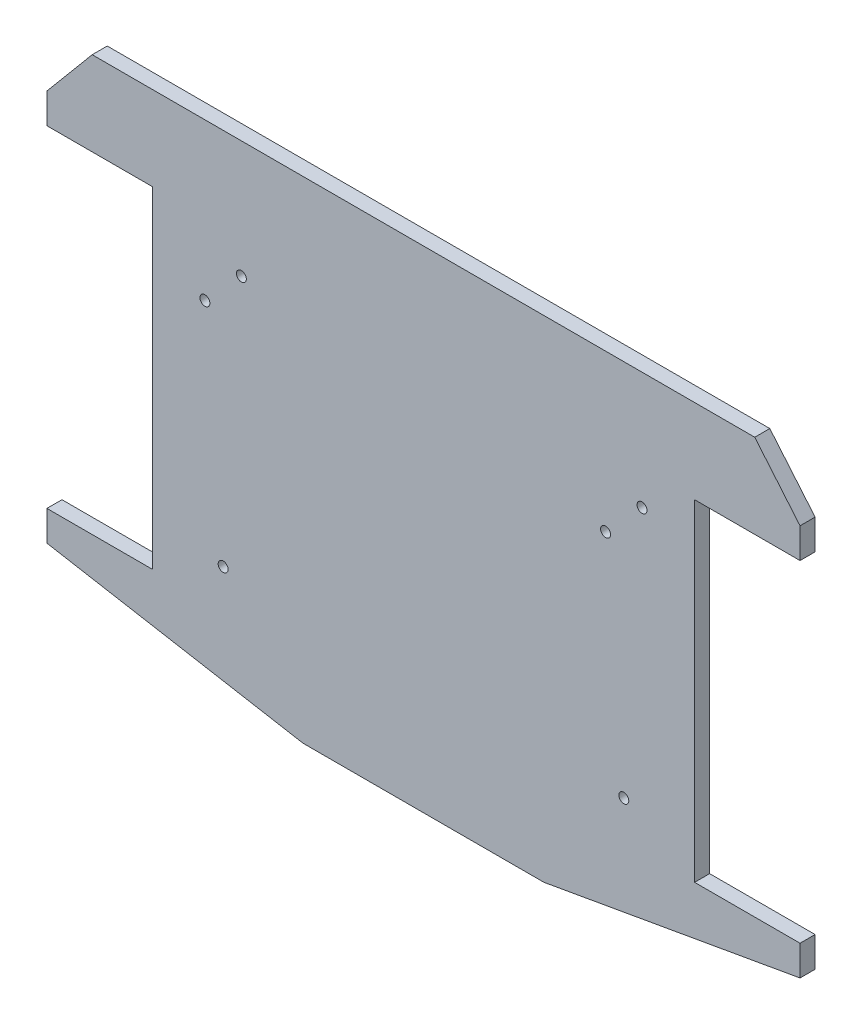
ISO-10303-21;
HEADER;
FILE_DESCRIPTION(('STEP AP214'),'2;1');
FILE_NAME('part.step','',(''),(''),'','','');
FILE_SCHEMA(('AUTOMOTIVE_DESIGN { 1 0 10303 214 1 1 1 1 }'));
ENDSEC;
DATA;
#1=APPLICATION_CONTEXT('core data for automotive mechanical design processes');
#2=APPLICATION_PROTOCOL_DEFINITION('international standard','automotive_design',2000,#1);
#3=PRODUCT_CONTEXT('',#1,'mechanical');
#4=PRODUCT('Part','Part','',(#3));
#5=PRODUCT_RELATED_PRODUCT_CATEGORY('part','',(#4));
#6=PRODUCT_DEFINITION_FORMATION('','',#4);
#7=PRODUCT_DEFINITION_CONTEXT('part definition',#1,'design');
#8=PRODUCT_DEFINITION('design','',#6,#7);
#9=PRODUCT_DEFINITION_SHAPE('','',#8);
#10=(LENGTH_UNIT() NAMED_UNIT(*) SI_UNIT(.MILLI.,.METRE.));
#11=(NAMED_UNIT(*) PLANE_ANGLE_UNIT() SI_UNIT($,.RADIAN.));
#12=(NAMED_UNIT(*) SI_UNIT($,.STERADIAN.) SOLID_ANGLE_UNIT());
#13=UNCERTAINTY_MEASURE_WITH_UNIT(LENGTH_MEASURE(1.E-05),#10,'distance_accuracy_value','');
#14=(GEOMETRIC_REPRESENTATION_CONTEXT(3) GLOBAL_UNCERTAINTY_ASSIGNED_CONTEXT((#13)) GLOBAL_UNIT_ASSIGNED_CONTEXT((#10,
#11,#12)) REPRESENTATION_CONTEXT('',''));
#15=CARTESIAN_POINT('',(0.,0.,0.));
#16=DIRECTION('',(0.,0.,1.));
#17=DIRECTION('',(1.,0.,0.));
#18=AXIS2_PLACEMENT_3D('',#15,#16,#17);
#19=CARTESIAN_POINT('',(194.06239308074,165.255996489893,27.4678207814801));
#20=DIRECTION('',(0.,-1.,0.));
#21=DIRECTION('',(0.,0.,-1.));
#22=AXIS2_PLACEMENT_3D('',#19,#20,#21);
#23=PLANE('',#22);
#24=DIRECTION('',(1.,0.,0.));
#25=VECTOR('',#24,1.);
#26=CARTESIAN_POINT('',(194.06239308074,165.255996489893,32.4678207814801));
#27=LINE('',#26,#25);
#28=CARTESIAN_POINT('',(159.06239308074,165.255996489893,32.4678207814801));
#29=VERTEX_POINT('',#28);
#30=CARTESIAN_POINT('',(194.06239308074,165.255996489893,32.4678207814801));
#31=VERTEX_POINT('',#30);
#32=EDGE_CURVE('E182',#29,#31,#27,.T.);
#33=ORIENTED_EDGE('',*,*,#32,.T.);
#34=DIRECTION('',(0.,0.,1.));
#35=VECTOR('',#34,1.);
#36=CARTESIAN_POINT('',(194.06239308074,165.255996489893,27.4678207814801));
#37=LINE('',#36,#35);
#38=CARTESIAN_POINT('',(194.06239308074,165.255996489893,27.4678207814801));
#39=VERTEX_POINT('',#38);
#40=EDGE_CURVE('E11',#39,#31,#37,.T.);
#41=ORIENTED_EDGE('',*,*,#40,.F.);
#42=DIRECTION('',(1.,0.,0.));
#43=VECTOR('',#42,1.);
#44=CARTESIAN_POINT('',(194.06239308074,165.255996489893,27.4678207814801));
#45=LINE('',#44,#43);
#46=CARTESIAN_POINT('',(159.06239308074,165.255996489893,27.4678207814801));
#47=VERTEX_POINT('',#46);
#48=EDGE_CURVE('E212',#47,#39,#45,.T.);
#49=ORIENTED_EDGE('',*,*,#48,.F.);
#50=DIRECTION('',(0.,0.,1.));
#51=VECTOR('',#50,1.);
#52=CARTESIAN_POINT('',(159.06239308074,165.255996489893,27.4678207814801));
#53=LINE('',#52,#51);
#54=EDGE_CURVE('E178',#47,#29,#53,.T.);
#55=ORIENTED_EDGE('',*,*,#54,.T.);
#56=EDGE_LOOP('',(#33,#41,#49,#55));
#57=FACE_BOUND('',#56,.T.);
#58=ADVANCED_FACE('F36',(#57),#23,.F.);
#59=CARTESIAN_POINT('',(194.06239308074,165.255996489893,27.4678207814801));
#60=DIRECTION('',(1.,0.,0.));
#61=DIRECTION('',(0.,0.,-1.));
#62=AXIS2_PLACEMENT_3D('',#59,#60,#61);
#63=PLANE('',#62);
#64=DIRECTION('',(0.,1.,0.));
#65=VECTOR('',#64,1.);
#66=CARTESIAN_POINT('',(194.06239308074,165.255996489893,32.4678207814801));
#67=LINE('',#66,#65);
#68=CARTESIAN_POINT('',(194.06239308074,275.255996489893,32.4678207814801));
#69=VERTEX_POINT('',#68);
#70=EDGE_CURVE('E185',#31,#69,#67,.T.);
#71=ORIENTED_EDGE('',*,*,#70,.T.);
#72=DIRECTION('',(0.,0.,1.));
#73=VECTOR('',#72,1.);
#74=CARTESIAN_POINT('',(194.06239308074,275.255996489893,27.4678207814801));
#75=LINE('',#74,#73);
#76=CARTESIAN_POINT('',(194.06239308074,275.255996489893,27.4678207814801));
#77=VERTEX_POINT('',#76);
#78=EDGE_CURVE('E45',#77,#69,#75,.T.);
#79=ORIENTED_EDGE('',*,*,#78,.F.);
#80=DIRECTION('',(0.,1.,0.));
#81=VECTOR('',#80,1.);
#82=CARTESIAN_POINT('',(194.06239308074,165.255996489893,27.4678207814801));
#83=LINE('',#82,#81);
#84=EDGE_CURVE('E121',#39,#77,#83,.T.);
#85=ORIENTED_EDGE('',*,*,#84,.F.);
#86=ORIENTED_EDGE('',*,*,#40,.T.);
#87=EDGE_LOOP('',(#71,#79,#85,#86));
#88=FACE_BOUND('',#87,.T.);
#89=ADVANCED_FACE('F300',(#88),#63,.F.);
#90=CARTESIAN_POINT('',(194.06239308074,275.255996489893,27.4678207814801));
#91=DIRECTION('',(0.,1.,0.));
#92=DIRECTION('',(0.,0.,1.));
#93=AXIS2_PLACEMENT_3D('',#90,#91,#92);
#94=PLANE('',#93);
#95=DIRECTION('',(-1.,0.,0.));
#96=VECTOR('',#95,1.);
#97=CARTESIAN_POINT('',(194.06239308074,275.255996489893,32.4678207814801));
#98=LINE('',#97,#96);
#99=CARTESIAN_POINT('',(159.06239308074,275.255996489893,32.4678207814801));
#100=VERTEX_POINT('',#99);
#101=EDGE_CURVE('E187',#69,#100,#98,.T.);
#102=ORIENTED_EDGE('',*,*,#101,.T.);
#103=DIRECTION('',(0.,0.,1.));
#104=VECTOR('',#103,1.);
#105=CARTESIAN_POINT('',(159.06239308074,275.255996489893,27.4678207814801));
#106=LINE('',#105,#104);
#107=CARTESIAN_POINT('',(159.06239308074,275.255996489893,27.4678207814801));
#108=VERTEX_POINT('',#107);
#109=EDGE_CURVE('E243',#108,#100,#106,.T.);
#110=ORIENTED_EDGE('',*,*,#109,.F.);
#111=DIRECTION('',(-1.,0.,0.));
#112=VECTOR('',#111,1.);
#113=CARTESIAN_POINT('',(194.06239308074,275.255996489893,27.4678207814801));
#114=LINE('',#113,#112);
#115=EDGE_CURVE('E458',#77,#108,#114,.T.);
#116=ORIENTED_EDGE('',*,*,#115,.F.);
#117=ORIENTED_EDGE('',*,*,#78,.T.);
#118=EDGE_LOOP('',(#102,#110,#116,#117));
#119=FACE_BOUND('',#118,.T.);
#120=ADVANCED_FACE('F304',(#119),#94,.F.);
#121=CARTESIAN_POINT('',(159.06239308074,285.255996489893,27.4678207814801));
#122=DIRECTION('',(1.,0.,0.));
#123=DIRECTION('',(0.,0.,-1.));
#124=AXIS2_PLACEMENT_3D('',#121,#122,#123);
#125=PLANE('',#124);
#126=DIRECTION('',(0.,1.,0.));
#127=VECTOR('',#126,1.);
#128=CARTESIAN_POINT('',(159.06239308074,285.255996489893,32.4678207814801));
#129=LINE('',#128,#127);
#130=CARTESIAN_POINT('',(159.06239308074,285.255996489893,32.4678207814801));
#131=VERTEX_POINT('',#130);
#132=EDGE_CURVE('E189',#100,#131,#129,.T.);
#133=ORIENTED_EDGE('',*,*,#132,.T.);
#134=DIRECTION('',(0.,0.,1.));
#135=VECTOR('',#134,1.);
#136=CARTESIAN_POINT('',(159.06239308074,285.255996489893,27.4678207814801));
#137=LINE('',#136,#135);
#138=CARTESIAN_POINT('',(159.06239308074,285.255996489893,27.4678207814801));
#139=VERTEX_POINT('',#138);
#140=EDGE_CURVE('E240',#139,#131,#137,.T.);
#141=ORIENTED_EDGE('',*,*,#140,.F.);
#142=DIRECTION('',(0.,1.,0.));
#143=VECTOR('',#142,1.);
#144=CARTESIAN_POINT('',(159.06239308074,285.255996489893,27.4678207814801));
#145=LINE('',#144,#143);
#146=EDGE_CURVE('E460',#108,#139,#145,.T.);
#147=ORIENTED_EDGE('',*,*,#146,.F.);
#148=ORIENTED_EDGE('',*,*,#109,.T.);
#149=EDGE_LOOP('',(#133,#141,#147,#148));
#150=FACE_BOUND('',#149,.T.);
#151=ADVANCED_FACE('F308',(#150),#125,.F.);
#152=CARTESIAN_POINT('',(174.093960564102,303.197713960334,27.4678207814801));
#153=DIRECTION('',(0.766534830722936,-0.642202735348082,0.));
#154=DIRECTION('',(0.642202735348082,0.766534830722937,0.));
#155=AXIS2_PLACEMENT_3D('',#152,#153,#154);
#156=PLANE('',#155);
#157=DIRECTION('',(0.642202735348082,0.766534830722936,0.));
#158=VECTOR('',#157,1.);
#159=CARTESIAN_POINT('',(174.093960564102,303.197713960334,32.4678207814801));
#160=LINE('',#159,#158);
#161=CARTESIAN_POINT('',(174.093960564102,303.197713960334,32.4678207814801));
#162=VERTEX_POINT('',#161);
#163=EDGE_CURVE('E191',#131,#162,#160,.T.);
#164=ORIENTED_EDGE('',*,*,#163,.T.);
#165=DIRECTION('',(0.,0.,1.));
#166=VECTOR('',#165,1.);
#167=CARTESIAN_POINT('',(174.093960564102,303.197713960334,27.4678207814801));
#168=LINE('',#167,#166);
#169=CARTESIAN_POINT('',(174.093960564102,303.197713960334,27.4678207814801));
#170=VERTEX_POINT('',#169);
#171=EDGE_CURVE('E237',#170,#162,#168,.T.);
#172=ORIENTED_EDGE('',*,*,#171,.F.);
#173=DIRECTION('',(0.642202735348082,0.766534830722936,0.));
#174=VECTOR('',#173,1.);
#175=CARTESIAN_POINT('',(174.093960564102,303.197713960334,27.4678207814801));
#176=LINE('',#175,#174);
#177=EDGE_CURVE('E462',#139,#170,#176,.T.);
#178=ORIENTED_EDGE('',*,*,#177,.F.);
#179=ORIENTED_EDGE('',*,*,#140,.T.);
#180=EDGE_LOOP('',(#164,#172,#178,#179));
#181=FACE_BOUND('',#180,.T.);
#182=ADVANCED_FACE('F314',(#181),#156,.F.);
#183=CARTESIAN_POINT('',(394.030825597377,303.197713960334,27.4678207814801));
#184=DIRECTION('',(0.,-1.,0.));
#185=DIRECTION('',(0.,0.,-1.));
#186=AXIS2_PLACEMENT_3D('',#183,#184,#185);
#187=PLANE('',#186);
#188=DIRECTION('',(1.,0.,0.));
#189=VECTOR('',#188,1.);
#190=CARTESIAN_POINT('',(394.030825597377,303.197713960334,32.4678207814801));
#191=LINE('',#190,#189);
#192=CARTESIAN_POINT('',(394.030825597377,303.197713960334,32.4678207814801));
#193=VERTEX_POINT('',#192);
#194=EDGE_CURVE('E193',#162,#193,#191,.T.);
#195=ORIENTED_EDGE('',*,*,#194,.T.);
#196=DIRECTION('',(0.,0.,1.));
#197=VECTOR('',#196,1.);
#198=CARTESIAN_POINT('',(394.030825597377,303.197713960334,27.4678207814801));
#199=LINE('',#198,#197);
#200=CARTESIAN_POINT('',(394.030825597377,303.197713960334,27.4678207814801));
#201=VERTEX_POINT('',#200);
#202=EDGE_CURVE('E234',#201,#193,#199,.T.);
#203=ORIENTED_EDGE('',*,*,#202,.F.);
#204=DIRECTION('',(1.,0.,0.));
#205=VECTOR('',#204,1.);
#206=CARTESIAN_POINT('',(394.030825597377,303.197713960334,27.4678207814801));
#207=LINE('',#206,#205);
#208=EDGE_CURVE('E464',#170,#201,#207,.T.);
#209=ORIENTED_EDGE('',*,*,#208,.F.);
#210=ORIENTED_EDGE('',*,*,#171,.T.);
#211=EDGE_LOOP('',(#195,#203,#209,#210));
#212=FACE_BOUND('',#211,.T.);
#213=ADVANCED_FACE('F318',(#212),#187,.F.);
#214=CARTESIAN_POINT('',(409.062393080712,285.25599648987,27.4678207814801));
#215=DIRECTION('',(-0.766534830723919,-0.64220273534691,0.));
#216=DIRECTION('',(0.64220273534691,-0.766534830723919,0.));
#217=AXIS2_PLACEMENT_3D('',#214,#215,#216);
#218=PLANE('',#217);
#219=DIRECTION('',(0.64220273534691,-0.766534830723919,0.));
#220=VECTOR('',#219,1.);
#221=CARTESIAN_POINT('',(409.062393080712,285.25599648987,32.4678207814801));
#222=LINE('',#221,#220);
#223=CARTESIAN_POINT('',(409.062393080712,285.25599648987,32.4678207814801));
#224=VERTEX_POINT('',#223);
#225=EDGE_CURVE('E195',#193,#224,#222,.T.);
#226=ORIENTED_EDGE('',*,*,#225,.T.);
#227=DIRECTION('',(0.,0.,1.));
#228=VECTOR('',#227,1.);
#229=CARTESIAN_POINT('',(409.062393080712,285.25599648987,27.4678207814801));
#230=LINE('',#229,#228);
#231=CARTESIAN_POINT('',(409.062393080712,285.25599648987,27.4678207814801));
#232=VERTEX_POINT('',#231);
#233=EDGE_CURVE('E231',#232,#224,#230,.T.);
#234=ORIENTED_EDGE('',*,*,#233,.F.);
#235=DIRECTION('',(0.64220273534691,-0.766534830723919,0.));
#236=VECTOR('',#235,1.);
#237=CARTESIAN_POINT('',(409.062393080712,285.25599648987,27.4678207814801));
#238=LINE('',#237,#236);
#239=EDGE_CURVE('E466',#201,#232,#238,.T.);
#240=ORIENTED_EDGE('',*,*,#239,.F.);
#241=ORIENTED_EDGE('',*,*,#202,.T.);
#242=EDGE_LOOP('',(#226,#234,#240,#241));
#243=FACE_BOUND('',#242,.T.);
#244=ADVANCED_FACE('F322',(#243),#218,.F.);
#245=CARTESIAN_POINT('',(409.062393080712,275.255996489893,27.4678207814801));
#246=DIRECTION('',(-1.,0.,0.));
#247=DIRECTION('',(0.,0.,1.));
#248=AXIS2_PLACEMENT_3D('',#245,#246,#247);
#249=PLANE('',#248);
#250=DIRECTION('',(0.,-1.,0.));
#251=VECTOR('',#250,1.);
#252=CARTESIAN_POINT('',(409.062393080712,275.255996489893,32.4678207814801));
#253=LINE('',#252,#251);
#254=CARTESIAN_POINT('',(409.062393080712,275.255996489893,32.4678207814801));
#255=VERTEX_POINT('',#254);
#256=EDGE_CURVE('E197',#224,#255,#253,.T.);
#257=ORIENTED_EDGE('',*,*,#256,.T.);
#258=DIRECTION('',(0.,0.,1.));
#259=VECTOR('',#258,1.);
#260=CARTESIAN_POINT('',(409.062393080712,275.255996489893,27.4678207814801));
#261=LINE('',#260,#259);
#262=CARTESIAN_POINT('',(409.062393080712,275.255996489893,27.4678207814801));
#263=VERTEX_POINT('',#262);
#264=EDGE_CURVE('E228',#263,#255,#261,.T.);
#265=ORIENTED_EDGE('',*,*,#264,.F.);
#266=DIRECTION('',(0.,-1.,0.));
#267=VECTOR('',#266,1.);
#268=CARTESIAN_POINT('',(409.062393080712,275.255996489893,27.4678207814801));
#269=LINE('',#268,#267);
#270=EDGE_CURVE('E468',#232,#263,#269,.T.);
#271=ORIENTED_EDGE('',*,*,#270,.F.);
#272=ORIENTED_EDGE('',*,*,#233,.T.);
#273=EDGE_LOOP('',(#257,#265,#271,#272));
#274=FACE_BOUND('',#273,.T.);
#275=ADVANCED_FACE('F326',(#274),#249,.F.);
#276=CARTESIAN_POINT('',(374.062393080739,275.255996489893,27.4678207814801));
#277=DIRECTION('',(0.,1.,0.));
#278=DIRECTION('',(0.,0.,1.));
#279=AXIS2_PLACEMENT_3D('',#276,#277,#278);
#280=PLANE('',#279);
#281=DIRECTION('',(-1.,0.,0.));
#282=VECTOR('',#281,1.);
#283=CARTESIAN_POINT('',(374.062393080739,275.255996489893,32.4678207814801));
#284=LINE('',#283,#282);
#285=CARTESIAN_POINT('',(374.062393080739,275.255996489893,32.4678207814801));
#286=VERTEX_POINT('',#285);
#287=EDGE_CURVE('E199',#255,#286,#284,.T.);
#288=ORIENTED_EDGE('',*,*,#287,.T.);
#289=DIRECTION('',(0.,0.,1.));
#290=VECTOR('',#289,1.);
#291=CARTESIAN_POINT('',(374.062393080739,275.255996489893,27.4678207814801));
#292=LINE('',#291,#290);
#293=CARTESIAN_POINT('',(374.062393080739,275.255996489893,27.4678207814801));
#294=VERTEX_POINT('',#293);
#295=EDGE_CURVE('E225',#294,#286,#292,.T.);
#296=ORIENTED_EDGE('',*,*,#295,.F.);
#297=DIRECTION('',(-1.,0.,0.));
#298=VECTOR('',#297,1.);
#299=CARTESIAN_POINT('',(374.062393080739,275.255996489893,27.4678207814801));
#300=LINE('',#299,#298);
#301=EDGE_CURVE('E470',#263,#294,#300,.T.);
#302=ORIENTED_EDGE('',*,*,#301,.F.);
#303=ORIENTED_EDGE('',*,*,#264,.T.);
#304=EDGE_LOOP('',(#288,#296,#302,#303));
#305=FACE_BOUND('',#304,.T.);
#306=ADVANCED_FACE('F330',(#305),#280,.F.);
#307=CARTESIAN_POINT('',(374.062393080739,165.255996489893,27.4678207814801));
#308=DIRECTION('',(-1.,0.,0.));
#309=DIRECTION('',(0.,-1.,0.));
#310=AXIS2_PLACEMENT_3D('',#307,#308,#309);
#311=PLANE('',#310);
#312=DIRECTION('',(0.,-1.,0.));
#313=VECTOR('',#312,1.);
#314=CARTESIAN_POINT('',(374.062393080739,165.255996489893,32.4678207814801));
#315=LINE('',#314,#313);
#316=CARTESIAN_POINT('',(374.062393080739,165.255996489893,32.4678207814801));
#317=VERTEX_POINT('',#316);
#318=EDGE_CURVE('E201',#286,#317,#315,.T.);
#319=ORIENTED_EDGE('',*,*,#318,.T.);
#320=DIRECTION('',(0.,0.,1.));
#321=VECTOR('',#320,1.);
#322=CARTESIAN_POINT('',(374.062393080739,165.255996489893,27.4678207814801));
#323=LINE('',#322,#321);
#324=CARTESIAN_POINT('',(374.062393080739,165.255996489893,27.4678207814801));
#325=VERTEX_POINT('',#324);
#326=EDGE_CURVE('E222',#325,#317,#323,.T.);
#327=ORIENTED_EDGE('',*,*,#326,.F.);
#328=DIRECTION('',(0.,-1.,0.));
#329=VECTOR('',#328,1.);
#330=CARTESIAN_POINT('',(374.062393080739,165.255996489893,27.4678207814801));
#331=LINE('',#330,#329);
#332=EDGE_CURVE('E472',#294,#325,#331,.T.);
#333=ORIENTED_EDGE('',*,*,#332,.F.);
#334=ORIENTED_EDGE('',*,*,#295,.T.);
#335=EDGE_LOOP('',(#319,#327,#333,#334));
#336=FACE_BOUND('',#335,.T.);
#337=ADVANCED_FACE('F334',(#336),#311,.F.);
#338=CARTESIAN_POINT('',(374.062393080739,165.255996489893,27.4678207814801));
#339=DIRECTION('',(0.,-1.,0.));
#340=DIRECTION('',(0.,0.,-1.));
#341=AXIS2_PLACEMENT_3D('',#338,#339,#340);
#342=PLANE('',#341);
#343=DIRECTION('',(1.,0.,0.));
#344=VECTOR('',#343,1.);
#345=CARTESIAN_POINT('',(374.062393080739,165.255996489893,32.4678207814801));
#346=LINE('',#345,#344);
#347=CARTESIAN_POINT('',(409.062393080739,165.255996489893,32.4678207814801));
#348=VERTEX_POINT('',#347);
#349=EDGE_CURVE('E203',#317,#348,#346,.T.);
#350=ORIENTED_EDGE('',*,*,#349,.T.);
#351=DIRECTION('',(0.,0.,1.));
#352=VECTOR('',#351,1.);
#353=CARTESIAN_POINT('',(409.062393080739,165.255996489893,27.4678207814801));
#354=LINE('',#353,#352);
#355=CARTESIAN_POINT('',(409.062393080739,165.255996489893,27.4678207814801));
#356=VERTEX_POINT('',#355);
#357=EDGE_CURVE('E219',#356,#348,#354,.T.);
#358=ORIENTED_EDGE('',*,*,#357,.F.);
#359=DIRECTION('',(1.,0.,0.));
#360=VECTOR('',#359,1.);
#361=CARTESIAN_POINT('',(374.062393080739,165.255996489893,27.4678207814801));
#362=LINE('',#361,#360);
#363=EDGE_CURVE('E474',#325,#356,#362,.T.);
#364=ORIENTED_EDGE('',*,*,#363,.F.);
#365=ORIENTED_EDGE('',*,*,#326,.T.);
#366=EDGE_LOOP('',(#350,#358,#364,#365));
#367=FACE_BOUND('',#366,.T.);
#368=ADVANCED_FACE('F338',(#367),#342,.F.);
#369=CARTESIAN_POINT('',(409.062393080739,165.255996489893,27.4678207814801));
#370=DIRECTION('',(-1.,0.,0.));
#371=DIRECTION('',(0.,0.,1.));
#372=AXIS2_PLACEMENT_3D('',#369,#370,#371);
#373=PLANE('',#372);
#374=DIRECTION('',(0.,-1.,0.));
#375=VECTOR('',#374,1.);
#376=CARTESIAN_POINT('',(409.062393080739,165.255996489893,32.4678207814801));
#377=LINE('',#376,#375);
#378=CARTESIAN_POINT('',(409.062393080739,155.255996489893,32.4678207814801));
#379=VERTEX_POINT('',#378);
#380=EDGE_CURVE('E205',#348,#379,#377,.T.);
#381=ORIENTED_EDGE('',*,*,#380,.T.);
#382=DIRECTION('',(0.,0.,1.));
#383=VECTOR('',#382,1.);
#384=CARTESIAN_POINT('',(409.062393080739,155.255996489893,27.4678207814801));
#385=LINE('',#384,#383);
#386=CARTESIAN_POINT('',(409.062393080739,155.255996489893,27.4678207814801));
#387=VERTEX_POINT('',#386);
#388=EDGE_CURVE('E216',#387,#379,#385,.T.);
#389=ORIENTED_EDGE('',*,*,#388,.F.);
#390=DIRECTION('',(0.,-1.,0.));
#391=VECTOR('',#390,1.);
#392=CARTESIAN_POINT('',(409.062393080739,165.255996489893,27.4678207814801));
#393=LINE('',#392,#391);
#394=EDGE_CURVE('E476',#356,#387,#393,.T.);
#395=ORIENTED_EDGE('',*,*,#394,.F.);
#396=ORIENTED_EDGE('',*,*,#357,.T.);
#397=EDGE_LOOP('',(#381,#389,#395,#396));
#398=FACE_BOUND('',#397,.T.);
#399=ADVANCED_FACE('F342',(#398),#373,.F.);
#400=CARTESIAN_POINT('',(324.062393080739,140.255996489893,27.4678207814801));
#401=DIRECTION('',(-0.173785333909048,0.984783558817937,0.));
#402=DIRECTION('',(-0.984783558817937,-0.173785333909048,0.));
#403=AXIS2_PLACEMENT_3D('',#400,#401,#402);
#404=PLANE('',#403);
#405=DIRECTION('',(-0.984783558817937,-0.173785333909048,0.));
#406=VECTOR('',#405,1.);
#407=CARTESIAN_POINT('',(324.062393080739,140.255996489893,32.4678207814801));
#408=LINE('',#407,#406);
#409=CARTESIAN_POINT('',(324.062393080739,140.255996489893,32.4678207814801));
#410=VERTEX_POINT('',#409);
#411=EDGE_CURVE('E207',#379,#410,#408,.T.);
#412=ORIENTED_EDGE('',*,*,#411,.T.);
#413=DIRECTION('',(0.,0.,1.));
#414=VECTOR('',#413,1.);
#415=CARTESIAN_POINT('',(324.062393080739,140.255996489893,27.4678207814801));
#416=LINE('',#415,#414);
#417=CARTESIAN_POINT('',(324.062393080739,140.255996489893,27.4678207814801));
#418=VERTEX_POINT('',#417);
#419=EDGE_CURVE('E173',#418,#410,#416,.T.);
#420=ORIENTED_EDGE('',*,*,#419,.F.);
#421=DIRECTION('',(-0.984783558817937,-0.173785333909048,0.));
#422=VECTOR('',#421,1.);
#423=CARTESIAN_POINT('',(324.062393080739,140.255996489893,27.4678207814801));
#424=LINE('',#423,#422);
#425=EDGE_CURVE('E164',#387,#418,#424,.T.);
#426=ORIENTED_EDGE('',*,*,#425,.F.);
#427=ORIENTED_EDGE('',*,*,#388,.T.);
#428=EDGE_LOOP('',(#412,#420,#426,#427));
#429=FACE_BOUND('',#428,.T.);
#430=ADVANCED_FACE('F346',(#429),#404,.F.);
#431=CARTESIAN_POINT('',(324.062393080739,140.255996489893,27.4678207814801));
#432=DIRECTION('',(0.,1.,0.));
#433=DIRECTION('',(0.,0.,1.));
#434=AXIS2_PLACEMENT_3D('',#431,#432,#433);
#435=PLANE('',#434);
#436=DIRECTION('',(-1.,0.,0.));
#437=VECTOR('',#436,1.);
#438=CARTESIAN_POINT('',(324.062393080739,140.255996489893,32.4678207814801));
#439=LINE('',#438,#437);
#440=CARTESIAN_POINT('',(244.062393080739,140.255996489893,32.4678207814801));
#441=VERTEX_POINT('',#440);
#442=EDGE_CURVE('E172',#410,#441,#439,.T.);
#443=ORIENTED_EDGE('',*,*,#442,.T.);
#444=DIRECTION('',(0.,0.,1.));
#445=VECTOR('',#444,1.);
#446=CARTESIAN_POINT('',(244.062393080739,140.255996489893,27.4678207814801));
#447=LINE('',#446,#445);
#448=CARTESIAN_POINT('',(244.062393080739,140.255996489893,27.4678207814801));
#449=VERTEX_POINT('',#448);
#450=EDGE_CURVE('E169',#449,#441,#447,.T.);
#451=ORIENTED_EDGE('',*,*,#450,.F.);
#452=DIRECTION('',(-1.,0.,0.));
#453=VECTOR('',#452,1.);
#454=CARTESIAN_POINT('',(324.062393080739,140.255996489893,27.4678207814801));
#455=LINE('',#454,#453);
#456=EDGE_CURVE('E158',#418,#449,#455,.T.);
#457=ORIENTED_EDGE('',*,*,#456,.F.);
#458=ORIENTED_EDGE('',*,*,#419,.T.);
#459=EDGE_LOOP('',(#443,#451,#457,#458));
#460=FACE_BOUND('',#459,.T.);
#461=ADVANCED_FACE('F170',(#460),#435,.F.);
#462=CARTESIAN_POINT('',(159.06239308074,155.255996489893,27.4678207814801));
#463=DIRECTION('',(0.173785333909048,0.984783558817937,0.));
#464=DIRECTION('',(-0.984783558817937,0.173785333909048,0.));
#465=AXIS2_PLACEMENT_3D('',#462,#463,#464);
#466=PLANE('',#465);
#467=DIRECTION('',(-0.984783558817937,0.173785333909048,0.));
#468=VECTOR('',#467,1.);
#469=CARTESIAN_POINT('',(159.06239308074,155.255996489893,32.4678207814801));
#470=LINE('',#469,#468);
#471=CARTESIAN_POINT('',(159.06239308074,155.255996489893,32.4678207814801));
#472=VERTEX_POINT('',#471);
#473=EDGE_CURVE('E107',#441,#472,#470,.T.);
#474=ORIENTED_EDGE('',*,*,#473,.T.);
#475=DIRECTION('',(0.,0.,1.));
#476=VECTOR('',#475,1.);
#477=CARTESIAN_POINT('',(159.06239308074,155.255996489893,27.4678207814801));
#478=LINE('',#477,#476);
#479=CARTESIAN_POINT('',(159.06239308074,155.255996489893,27.4678207814801));
#480=VERTEX_POINT('',#479);
#481=EDGE_CURVE('E174',#480,#472,#478,.T.);
#482=ORIENTED_EDGE('',*,*,#481,.F.);
#483=DIRECTION('',(-0.984783558817937,0.173785333909048,0.));
#484=VECTOR('',#483,1.);
#485=CARTESIAN_POINT('',(159.06239308074,155.255996489893,27.4678207814801));
#486=LINE('',#485,#484);
#487=EDGE_CURVE('E162',#449,#480,#486,.T.);
#488=ORIENTED_EDGE('',*,*,#487,.F.);
#489=ORIENTED_EDGE('',*,*,#450,.T.);
#490=EDGE_LOOP('',(#474,#482,#488,#489));
#491=FACE_BOUND('',#490,.T.);
#492=ADVANCED_FACE('F176',(#491),#466,.F.);
#493=CARTESIAN_POINT('',(159.06239308074,165.255996489893,27.4678207814801));
#494=DIRECTION('',(1.,0.,0.));
#495=DIRECTION('',(0.,0.,-1.));
#496=AXIS2_PLACEMENT_3D('',#493,#494,#495);
#497=PLANE('',#496);
#498=DIRECTION('',(0.,1.,0.));
#499=VECTOR('',#498,1.);
#500=CARTESIAN_POINT('',(159.06239308074,165.255996489893,32.4678207814801));
#501=LINE('',#500,#499);
#502=EDGE_CURVE('E113',#472,#29,#501,.T.);
#503=ORIENTED_EDGE('',*,*,#502,.T.);
#504=ORIENTED_EDGE('',*,*,#54,.F.);
#505=DIRECTION('',(0.,1.,0.));
#506=VECTOR('',#505,1.);
#507=CARTESIAN_POINT('',(159.06239308074,165.255996489893,27.4678207814801));
#508=LINE('',#507,#506);
#509=EDGE_CURVE('E54',#480,#47,#508,.T.);
#510=ORIENTED_EDGE('',*,*,#509,.F.);
#511=ORIENTED_EDGE('',*,*,#481,.T.);
#512=EDGE_LOOP('',(#503,#504,#510,#511));
#513=FACE_BOUND('',#512,.T.);
#514=ADVANCED_FACE('F289',(#513),#497,.F.);
#515=CARTESIAN_POINT('',(0.,0.,27.4678207814801));
#516=DIRECTION('',(0.,0.,1.));
#517=DIRECTION('',(1.,0.,0.));
#518=AXIS2_PLACEMENT_3D('',#515,#516,#517);
#519=PLANE('',#518);
#520=CARTESIAN_POINT('',(350.56239308074,177.755996489893,27.4678207814801));
#521=DIRECTION('',(0.,0.,-1.));
#522=DIRECTION('',(-1.,0.,0.));
#523=AXIS2_PLACEMENT_3D('',#520,#521,#522);
#524=CIRCLE('',#523,1.64999999999998);
#525=CARTESIAN_POINT('',(348.91239308074,177.755996489893,27.4678207814801));
#526=VERTEX_POINT('',#525);
#527=EDGE_CURVE('E441',#526,#526,#524,.T.);
#528=ORIENTED_EDGE('',*,*,#527,.F.);
#529=EDGE_LOOP('',(#528));
#530=FACE_BOUND('',#529,.T.);
#531=CARTESIAN_POINT('',(356.614117218671,264.255996489893,27.4678207814801));
#532=DIRECTION('',(0.,0.,-1.));
#533=DIRECTION('',(-1.,0.,0.));
#534=AXIS2_PLACEMENT_3D('',#531,#532,#533);
#535=CIRCLE('',#534,1.64999999999999);
#536=CARTESIAN_POINT('',(354.964117218671,264.255996489893,27.4678207814801));
#537=VERTEX_POINT('',#536);
#538=EDGE_CURVE('E439',#537,#537,#535,.T.);
#539=ORIENTED_EDGE('',*,*,#538,.F.);
#540=EDGE_LOOP('',(#539));
#541=FACE_BOUND('',#540,.T.);
#542=CARTESIAN_POINT('',(344.510668942809,251.255996489893,27.4678207814801));
#543=DIRECTION('',(0.,0.,-1.));
#544=DIRECTION('',(-1.,0.,0.));
#545=AXIS2_PLACEMENT_3D('',#542,#543,#544);
#546=CIRCLE('',#545,1.64999999999999);
#547=CARTESIAN_POINT('',(342.860668942809,251.255996489893,27.4678207814801));
#548=VERTEX_POINT('',#547);
#549=EDGE_CURVE('E442',#548,#548,#546,.T.);
#550=ORIENTED_EDGE('',*,*,#549,.F.);
#551=EDGE_LOOP('',(#550));
#552=FACE_BOUND('',#551,.T.);
#553=CARTESIAN_POINT('',(211.510668942809,251.255996489893,27.4678207814801));
#554=DIRECTION('',(0.,0.,-1.));
#555=DIRECTION('',(-1.,0.,0.));
#556=AXIS2_PLACEMENT_3D('',#553,#554,#555);
#557=CIRCLE('',#556,1.64999999999999);
#558=CARTESIAN_POINT('',(209.860668942809,251.255996489893,27.4678207814801));
#559=VERTEX_POINT('',#558);
#560=EDGE_CURVE('E447',#559,#559,#557,.T.);
#561=ORIENTED_EDGE('',*,*,#560,.F.);
#562=EDGE_LOOP('',(#561));
#563=FACE_BOUND('',#562,.T.);
#564=CARTESIAN_POINT('',(223.614117218671,264.255996489893,27.4678207814801));
#565=DIRECTION('',(0.,0.,-1.));
#566=DIRECTION('',(-1.,0.,0.));
#567=AXIS2_PLACEMENT_3D('',#564,#565,#566);
#568=CIRCLE('',#567,1.65000000000005);
#569=CARTESIAN_POINT('',(221.964117218671,264.255996489893,27.4678207814801));
#570=VERTEX_POINT('',#569);
#571=EDGE_CURVE('E453',#570,#570,#568,.T.);
#572=ORIENTED_EDGE('',*,*,#571,.F.);
#573=EDGE_LOOP('',(#572));
#574=FACE_BOUND('',#573,.T.);
#575=CARTESIAN_POINT('',(217.562393080739,177.755996489894,27.4678207814801));
#576=DIRECTION('',(0.,0.,-1.));
#577=DIRECTION('',(-1.,0.,0.));
#578=AXIS2_PLACEMENT_3D('',#575,#576,#577);
#579=CIRCLE('',#578,1.65000000000002);
#580=CARTESIAN_POINT('',(215.912393080739,177.755996489894,27.4678207814801));
#581=VERTEX_POINT('',#580);
#582=EDGE_CURVE('E252',#581,#581,#579,.T.);
#583=ORIENTED_EDGE('',*,*,#582,.F.);
#584=EDGE_LOOP('',(#583));
#585=FACE_BOUND('',#584,.T.);
#586=ORIENTED_EDGE('',*,*,#48,.T.);
#587=ORIENTED_EDGE('',*,*,#84,.T.);
#588=ORIENTED_EDGE('',*,*,#115,.T.);
#589=ORIENTED_EDGE('',*,*,#146,.T.);
#590=ORIENTED_EDGE('',*,*,#177,.T.);
#591=ORIENTED_EDGE('',*,*,#208,.T.);
#592=ORIENTED_EDGE('',*,*,#239,.T.);
#593=ORIENTED_EDGE('',*,*,#270,.T.);
#594=ORIENTED_EDGE('',*,*,#301,.T.);
#595=ORIENTED_EDGE('',*,*,#332,.T.);
#596=ORIENTED_EDGE('',*,*,#363,.T.);
#597=ORIENTED_EDGE('',*,*,#394,.T.);
#598=ORIENTED_EDGE('',*,*,#425,.T.);
#599=ORIENTED_EDGE('',*,*,#456,.T.);
#600=ORIENTED_EDGE('',*,*,#487,.T.);
#601=ORIENTED_EDGE('',*,*,#509,.T.);
#602=EDGE_LOOP('',(#586,#587,#588,#589,#590,#591,#592,#593,#594,#595,#596,#597,#598,#599,#600,#601));
#603=FACE_BOUND('',#602,.T.);
#604=ADVANCED_FACE('F160',(#530,#541,#552,#563,#574,#585,#603),#519,.F.);
#605=CARTESIAN_POINT('',(0.,0.,32.4678207814801));
#606=DIRECTION('',(0.,0.,1.));
#607=DIRECTION('',(1.,0.,0.));
#608=AXIS2_PLACEMENT_3D('',#605,#606,#607);
#609=PLANE('',#608);
#610=CARTESIAN_POINT('',(350.56239308074,177.755996489893,32.4678207814801));
#611=DIRECTION('',(0.,0.,1.));
#612=DIRECTION('',(1.,0.,0.));
#613=AXIS2_PLACEMENT_3D('',#610,#611,#612);
#614=CIRCLE('',#613,1.64999999999998);
#615=CARTESIAN_POINT('',(352.21239308074,177.755996489893,32.4678207814801));
#616=VERTEX_POINT('',#615);
#617=EDGE_CURVE('E39',#616,#616,#614,.T.);
#618=ORIENTED_EDGE('',*,*,#617,.F.);
#619=EDGE_LOOP('',(#618));
#620=FACE_BOUND('',#619,.T.);
#621=CARTESIAN_POINT('',(356.614117218671,264.255996489893,32.4678207814801));
#622=DIRECTION('',(0.,0.,1.));
#623=DIRECTION('',(1.,0.,0.));
#624=AXIS2_PLACEMENT_3D('',#621,#622,#623);
#625=CIRCLE('',#624,1.64999999999999);
#626=CARTESIAN_POINT('',(358.264117218671,264.255996489893,32.4678207814801));
#627=VERTEX_POINT('',#626);
#628=EDGE_CURVE('E260',#627,#627,#625,.T.);
#629=ORIENTED_EDGE('',*,*,#628,.F.);
#630=EDGE_LOOP('',(#629));
#631=FACE_BOUND('',#630,.T.);
#632=CARTESIAN_POINT('',(344.510668942809,251.255996489893,32.4678207814801));
#633=DIRECTION('',(0.,0.,1.));
#634=DIRECTION('',(1.,0.,0.));
#635=AXIS2_PLACEMENT_3D('',#632,#633,#634);
#636=CIRCLE('',#635,1.64999999999999);
#637=CARTESIAN_POINT('',(346.160668942809,251.255996489893,32.4678207814801));
#638=VERTEX_POINT('',#637);
#639=EDGE_CURVE('E258',#638,#638,#636,.T.);
#640=ORIENTED_EDGE('',*,*,#639,.F.);
#641=EDGE_LOOP('',(#640));
#642=FACE_BOUND('',#641,.T.);
#643=CARTESIAN_POINT('',(211.510668942809,251.255996489893,32.4678207814801));
#644=DIRECTION('',(0.,0.,1.));
#645=DIRECTION('',(1.,0.,0.));
#646=AXIS2_PLACEMENT_3D('',#643,#644,#645);
#647=CIRCLE('',#646,1.64999999999999);
#648=CARTESIAN_POINT('',(213.160668942809,251.255996489893,32.4678207814801));
#649=VERTEX_POINT('',#648);
#650=EDGE_CURVE('E255',#649,#649,#647,.T.);
#651=ORIENTED_EDGE('',*,*,#650,.F.);
#652=EDGE_LOOP('',(#651));
#653=FACE_BOUND('',#652,.T.);
#654=CARTESIAN_POINT('',(223.614117218671,264.255996489893,32.4678207814801));
#655=DIRECTION('',(0.,0.,1.));
#656=DIRECTION('',(1.,0.,0.));
#657=AXIS2_PLACEMENT_3D('',#654,#655,#656);
#658=CIRCLE('',#657,1.65000000000005);
#659=CARTESIAN_POINT('',(225.264117218671,264.255996489893,32.4678207814801));
#660=VERTEX_POINT('',#659);
#661=EDGE_CURVE('E251',#660,#660,#658,.T.);
#662=ORIENTED_EDGE('',*,*,#661,.F.);
#663=EDGE_LOOP('',(#662));
#664=FACE_BOUND('',#663,.T.);
#665=CARTESIAN_POINT('',(217.562393080739,177.755996489894,32.4678207814801));
#666=DIRECTION('',(0.,0.,1.));
#667=DIRECTION('',(1.,0.,0.));
#668=AXIS2_PLACEMENT_3D('',#665,#666,#667);
#669=CIRCLE('',#668,1.65000000000002);
#670=CARTESIAN_POINT('',(219.212393080739,177.755996489894,32.4678207814801));
#671=VERTEX_POINT('',#670);
#672=EDGE_CURVE('E248',#671,#671,#669,.T.);
#673=ORIENTED_EDGE('',*,*,#672,.F.);
#674=EDGE_LOOP('',(#673));
#675=FACE_BOUND('',#674,.T.);
#676=ORIENTED_EDGE('',*,*,#32,.F.);
#677=ORIENTED_EDGE('',*,*,#502,.F.);
#678=ORIENTED_EDGE('',*,*,#473,.F.);
#679=ORIENTED_EDGE('',*,*,#442,.F.);
#680=ORIENTED_EDGE('',*,*,#411,.F.);
#681=ORIENTED_EDGE('',*,*,#380,.F.);
#682=ORIENTED_EDGE('',*,*,#349,.F.);
#683=ORIENTED_EDGE('',*,*,#318,.F.);
#684=ORIENTED_EDGE('',*,*,#287,.F.);
#685=ORIENTED_EDGE('',*,*,#256,.F.);
#686=ORIENTED_EDGE('',*,*,#225,.F.);
#687=ORIENTED_EDGE('',*,*,#194,.F.);
#688=ORIENTED_EDGE('',*,*,#163,.F.);
#689=ORIENTED_EDGE('',*,*,#132,.F.);
#690=ORIENTED_EDGE('',*,*,#101,.F.);
#691=ORIENTED_EDGE('',*,*,#70,.F.);
#692=EDGE_LOOP('',(#676,#677,#678,#679,#680,#681,#682,#683,#684,#685,#686,#687,#688,#689,#690,#691));
#693=FACE_BOUND('',#692,.T.);
#694=ADVANCED_FACE('F270',(#620,#631,#642,#653,#664,#675,#693),#609,.T.);
#695=CARTESIAN_POINT('',(217.562393080739,177.755996489894,37.4678207814801));
#696=DIRECTION('',(0.,0.,-1.));
#697=DIRECTION('',(-1.,0.,0.));
#698=AXIS2_PLACEMENT_3D('',#695,#696,#697);
#699=CYLINDRICAL_SURFACE('',#698,1.65000000000002);
#700=ORIENTED_EDGE('',*,*,#672,.T.);
#701=EDGE_LOOP('',(#700));
#702=FACE_BOUND('',#701,.T.);
#703=ORIENTED_EDGE('',*,*,#582,.T.);
#704=EDGE_LOOP('',(#703));
#705=FACE_BOUND('',#704,.T.);
#706=ADVANCED_FACE('F273',(#702,#705),#699,.F.);
#707=CARTESIAN_POINT('',(223.614117218671,264.255996489893,37.4678207814801));
#708=DIRECTION('',(0.,0.,-1.));
#709=DIRECTION('',(-1.,0.,0.));
#710=AXIS2_PLACEMENT_3D('',#707,#708,#709);
#711=CYLINDRICAL_SURFACE('',#710,1.65000000000005);
#712=ORIENTED_EDGE('',*,*,#661,.T.);
#713=EDGE_LOOP('',(#712));
#714=FACE_BOUND('',#713,.T.);
#715=ORIENTED_EDGE('',*,*,#571,.T.);
#716=EDGE_LOOP('',(#715));
#717=FACE_BOUND('',#716,.T.);
#718=ADVANCED_FACE('F385',(#714,#717),#711,.F.);
#719=CARTESIAN_POINT('',(211.510668942809,251.255996489893,37.4678207814801));
#720=DIRECTION('',(0.,0.,-1.));
#721=DIRECTION('',(-1.,0.,0.));
#722=AXIS2_PLACEMENT_3D('',#719,#720,#721);
#723=CYLINDRICAL_SURFACE('',#722,1.64999999999999);
#724=ORIENTED_EDGE('',*,*,#650,.T.);
#725=EDGE_LOOP('',(#724));
#726=FACE_BOUND('',#725,.T.);
#727=ORIENTED_EDGE('',*,*,#560,.T.);
#728=EDGE_LOOP('',(#727));
#729=FACE_BOUND('',#728,.T.);
#730=ADVANCED_FACE('F395',(#726,#729),#723,.F.);
#731=CARTESIAN_POINT('',(344.510668942809,251.255996489893,37.4678207814801));
#732=DIRECTION('',(0.,0.,-1.));
#733=DIRECTION('',(-1.,0.,0.));
#734=AXIS2_PLACEMENT_3D('',#731,#732,#733);
#735=CYLINDRICAL_SURFACE('',#734,1.64999999999999);
#736=ORIENTED_EDGE('',*,*,#639,.T.);
#737=EDGE_LOOP('',(#736));
#738=FACE_BOUND('',#737,.T.);
#739=ORIENTED_EDGE('',*,*,#549,.T.);
#740=EDGE_LOOP('',(#739));
#741=FACE_BOUND('',#740,.T.);
#742=ADVANCED_FACE('F405',(#738,#741),#735,.F.);
#743=CARTESIAN_POINT('',(356.614117218671,264.255996489893,37.4678207814801));
#744=DIRECTION('',(0.,0.,-1.));
#745=DIRECTION('',(-1.,0.,0.));
#746=AXIS2_PLACEMENT_3D('',#743,#744,#745);
#747=CYLINDRICAL_SURFACE('',#746,1.64999999999999);
#748=ORIENTED_EDGE('',*,*,#628,.T.);
#749=EDGE_LOOP('',(#748));
#750=FACE_BOUND('',#749,.T.);
#751=ORIENTED_EDGE('',*,*,#538,.T.);
#752=EDGE_LOOP('',(#751));
#753=FACE_BOUND('',#752,.T.);
#754=ADVANCED_FACE('F415',(#750,#753),#747,.F.);
#755=CARTESIAN_POINT('',(350.56239308074,177.755996489893,37.4678207814801));
#756=DIRECTION('',(0.,0.,-1.));
#757=DIRECTION('',(-1.,0.,0.));
#758=AXIS2_PLACEMENT_3D('',#755,#756,#757);
#759=CYLINDRICAL_SURFACE('',#758,1.64999999999998);
#760=ORIENTED_EDGE('',*,*,#617,.T.);
#761=EDGE_LOOP('',(#760));
#762=FACE_BOUND('',#761,.T.);
#763=ORIENTED_EDGE('',*,*,#527,.T.);
#764=EDGE_LOOP('',(#763));
#765=FACE_BOUND('',#764,.T.);
#766=ADVANCED_FACE('F267',(#762,#765),#759,.F.);
#767=CLOSED_SHELL('',(#58,#89,#120,#151,#182,#213,#244,#275,#306,#337,#368,#399,#430,#461,#492,
#514,#604,#694,#706,#718,#730,#742,#754,#766));
#768=MANIFOLD_SOLID_BREP('B2',#767);
#769=ADVANCED_BREP_SHAPE_REPRESENTATION('',(#18,#768),#14);
#770=SHAPE_DEFINITION_REPRESENTATION(#9,#769);
ENDSEC;
END-ISO-10303-21;
